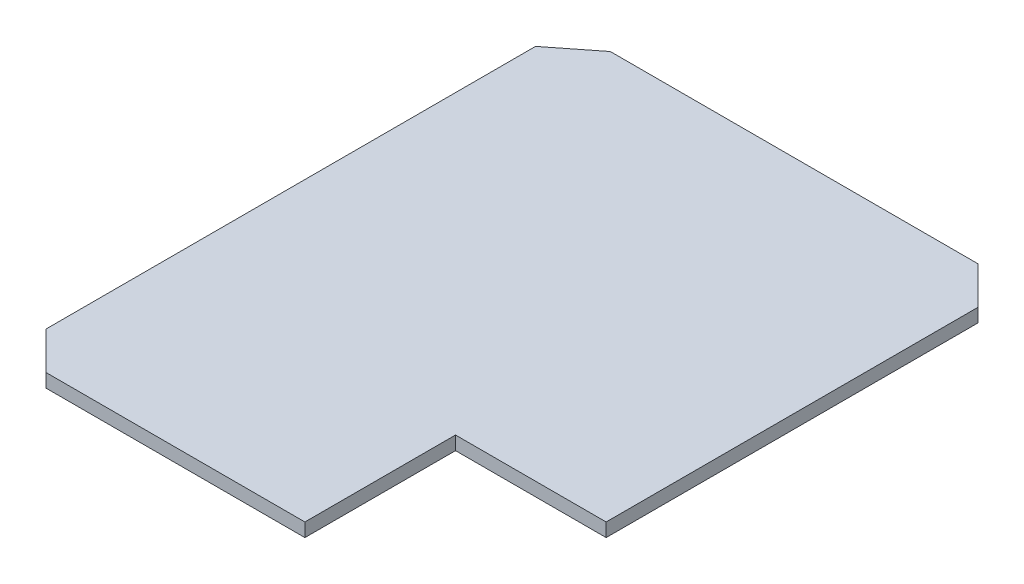
ISO-10303-21;
HEADER;
FILE_DESCRIPTION(('STEP AP214'),'2;1');
FILE_NAME('part.step','',(''),(''),'','','');
FILE_SCHEMA(('AUTOMOTIVE_DESIGN { 1 0 10303 214 1 1 1 1 }'));
ENDSEC;
DATA;
#1=APPLICATION_CONTEXT('core data for automotive mechanical design processes');
#2=APPLICATION_PROTOCOL_DEFINITION('international standard','automotive_design',2000,#1);
#3=PRODUCT_CONTEXT('',#1,'mechanical');
#4=PRODUCT('Part','Part','',(#3));
#5=PRODUCT_RELATED_PRODUCT_CATEGORY('part','',(#4));
#6=PRODUCT_DEFINITION_FORMATION('','',#4);
#7=PRODUCT_DEFINITION_CONTEXT('part definition',#1,'design');
#8=PRODUCT_DEFINITION('design','',#6,#7);
#9=PRODUCT_DEFINITION_SHAPE('','',#8);
#10=(LENGTH_UNIT() NAMED_UNIT(*) SI_UNIT(.MILLI.,.METRE.));
#11=(NAMED_UNIT(*) PLANE_ANGLE_UNIT() SI_UNIT($,.RADIAN.));
#12=(NAMED_UNIT(*) SI_UNIT($,.STERADIAN.) SOLID_ANGLE_UNIT());
#13=UNCERTAINTY_MEASURE_WITH_UNIT(LENGTH_MEASURE(1.E-05),#10,'distance_accuracy_value','');
#14=(GEOMETRIC_REPRESENTATION_CONTEXT(3) GLOBAL_UNCERTAINTY_ASSIGNED_CONTEXT((#13)) GLOBAL_UNIT_ASSIGNED_CONTEXT((#10,
#11,#12)) REPRESENTATION_CONTEXT('',''));
#15=CARTESIAN_POINT('',(0.,0.,0.));
#16=DIRECTION('',(0.,0.,1.));
#17=DIRECTION('',(1.,0.,0.));
#18=AXIS2_PLACEMENT_3D('',#15,#16,#17);
#19=CARTESIAN_POINT('',(146.05,18.288,571.79217167905));
#20=DIRECTION('',(0.,0.,-1.));
#21=DIRECTION('',(-1.,0.,0.));
#22=AXIS2_PLACEMENT_3D('',#19,#20,#21);
#23=PLANE('',#22);
#24=DIRECTION('',(1.,0.,0.));
#25=VECTOR('',#24,1.);
#26=CARTESIAN_POINT('',(146.05,0.,571.79217167905));
#27=LINE('',#26,#25);
#28=CARTESIAN_POINT('',(-203.2,0.,571.79217167905));
#29=VERTEX_POINT('',#28);
#30=CARTESIAN_POINT('',(146.05,0.,571.79217167905));
#31=VERTEX_POINT('',#30);
#32=EDGE_CURVE('E134',#29,#31,#27,.T.);
#33=ORIENTED_EDGE('',*,*,#32,.T.);
#34=DIRECTION('',(0.,-1.,0.));
#35=VECTOR('',#34,1.);
#36=CARTESIAN_POINT('',(146.05,18.288,571.79217167905));
#37=LINE('',#36,#35);
#38=CARTESIAN_POINT('',(146.05,18.288,571.79217167905));
#39=VERTEX_POINT('',#38);
#40=EDGE_CURVE('E11',#39,#31,#37,.T.);
#41=ORIENTED_EDGE('',*,*,#40,.F.);
#42=DIRECTION('',(1.,0.,0.));
#43=VECTOR('',#42,1.);
#44=CARTESIAN_POINT('',(146.05,18.288,571.79217167905));
#45=LINE('',#44,#43);
#46=CARTESIAN_POINT('',(-203.2,18.288,571.79217167905));
#47=VERTEX_POINT('',#46);
#48=EDGE_CURVE('E150',#47,#39,#45,.T.);
#49=ORIENTED_EDGE('',*,*,#48,.F.);
#50=DIRECTION('',(0.,-1.,0.));
#51=VECTOR('',#50,1.);
#52=CARTESIAN_POINT('',(-203.2,18.288,571.79217167905));
#53=LINE('',#52,#51);
#54=EDGE_CURVE('E130',#47,#29,#53,.T.);
#55=ORIENTED_EDGE('',*,*,#54,.T.);
#56=EDGE_LOOP('',(#33,#41,#49,#55));
#57=FACE_BOUND('',#56,.T.);
#58=ADVANCED_FACE('F32',(#57),#23,.F.);
#59=CARTESIAN_POINT('',(146.05,18.288,571.79217167905));
#60=DIRECTION('',(-1.,0.,0.));
#61=DIRECTION('',(0.,0.,1.));
#62=AXIS2_PLACEMENT_3D('',#59,#60,#61);
#63=PLANE('',#62);
#64=DIRECTION('',(0.,0.,-1.));
#65=VECTOR('',#64,1.);
#66=CARTESIAN_POINT('',(146.05,0.,571.79217167905));
#67=LINE('',#66,#65);
#68=CARTESIAN_POINT('',(146.05,0.,368.59217167905));
#69=VERTEX_POINT('',#68);
#70=EDGE_CURVE('E137',#31,#69,#67,.T.);
#71=ORIENTED_EDGE('',*,*,#70,.T.);
#72=DIRECTION('',(0.,-1.,0.));
#73=VECTOR('',#72,1.);
#74=CARTESIAN_POINT('',(146.05,18.288,368.59217167905));
#75=LINE('',#74,#73);
#76=CARTESIAN_POINT('',(146.05,18.288,368.59217167905));
#77=VERTEX_POINT('',#76);
#78=EDGE_CURVE('E40',#77,#69,#75,.T.);
#79=ORIENTED_EDGE('',*,*,#78,.F.);
#80=DIRECTION('',(0.,0.,-1.));
#81=VECTOR('',#80,1.);
#82=CARTESIAN_POINT('',(146.05,18.288,571.79217167905));
#83=LINE('',#82,#81);
#84=EDGE_CURVE('E94',#39,#77,#83,.T.);
#85=ORIENTED_EDGE('',*,*,#84,.F.);
#86=ORIENTED_EDGE('',*,*,#40,.T.);
#87=EDGE_LOOP('',(#71,#79,#85,#86));
#88=FACE_BOUND('',#87,.T.);
#89=ADVANCED_FACE('F193',(#88),#63,.F.);
#90=CARTESIAN_POINT('',(146.05,18.288,368.59217167905));
#91=DIRECTION('',(0.,0.,-1.));
#92=DIRECTION('',(-1.,0.,0.));
#93=AXIS2_PLACEMENT_3D('',#90,#91,#92);
#94=PLANE('',#93);
#95=DIRECTION('',(1.,0.,0.));
#96=VECTOR('',#95,1.);
#97=CARTESIAN_POINT('',(146.05,0.,368.59217167905));
#98=LINE('',#97,#96);
#99=CARTESIAN_POINT('',(349.25,0.,368.59217167905));
#100=VERTEX_POINT('',#99);
#101=EDGE_CURVE('E139',#69,#100,#98,.T.);
#102=ORIENTED_EDGE('',*,*,#101,.T.);
#103=DIRECTION('',(0.,-1.,0.));
#104=VECTOR('',#103,1.);
#105=CARTESIAN_POINT('',(349.25,18.288,368.59217167905));
#106=LINE('',#105,#104);
#107=CARTESIAN_POINT('',(349.25,18.288,368.59217167905));
#108=VERTEX_POINT('',#107);
#109=EDGE_CURVE('E160',#108,#100,#106,.T.);
#110=ORIENTED_EDGE('',*,*,#109,.F.);
#111=DIRECTION('',(1.,0.,0.));
#112=VECTOR('',#111,1.);
#113=CARTESIAN_POINT('',(146.05,18.288,368.59217167905));
#114=LINE('',#113,#112);
#115=EDGE_CURVE('E168',#77,#108,#114,.T.);
#116=ORIENTED_EDGE('',*,*,#115,.F.);
#117=ORIENTED_EDGE('',*,*,#78,.T.);
#118=EDGE_LOOP('',(#102,#110,#116,#117));
#119=FACE_BOUND('',#118,.T.);
#120=ADVANCED_FACE('F166',(#119),#94,.F.);
#121=CARTESIAN_POINT('',(349.25,18.288,-133.057828320949));
#122=DIRECTION('',(-1.,0.,0.));
#123=DIRECTION('',(0.,0.,1.));
#124=AXIS2_PLACEMENT_3D('',#121,#122,#123);
#125=PLANE('',#124);
#126=DIRECTION('',(0.,0.,-1.));
#127=VECTOR('',#126,1.);
#128=CARTESIAN_POINT('',(349.25,0.,-133.057828320949));
#129=LINE('',#128,#127);
#130=CARTESIAN_POINT('',(349.25,0.,-133.057828320949));
#131=VERTEX_POINT('',#130);
#132=EDGE_CURVE('E141',#100,#131,#129,.T.);
#133=ORIENTED_EDGE('',*,*,#132,.T.);
#134=DIRECTION('',(0.,-1.,0.));
#135=VECTOR('',#134,1.);
#136=CARTESIAN_POINT('',(349.25,18.288,-133.057828320949));
#137=LINE('',#136,#135);
#138=CARTESIAN_POINT('',(349.25,18.288,-133.057828320949));
#139=VERTEX_POINT('',#138);
#140=EDGE_CURVE('E157',#139,#131,#137,.T.);
#141=ORIENTED_EDGE('',*,*,#140,.F.);
#142=DIRECTION('',(0.,0.,-1.));
#143=VECTOR('',#142,1.);
#144=CARTESIAN_POINT('',(349.25,18.288,-133.057828320949));
#145=LINE('',#144,#143);
#146=EDGE_CURVE('E184',#108,#139,#145,.T.);
#147=ORIENTED_EDGE('',*,*,#146,.F.);
#148=ORIENTED_EDGE('',*,*,#109,.T.);
#149=EDGE_LOOP('',(#133,#141,#147,#148));
#150=FACE_BOUND('',#149,.T.);
#151=ADVANCED_FACE('F177',(#150),#125,.F.);
#152=CARTESIAN_POINT('',(298.45,18.288,-183.857828320949));
#153=DIRECTION('',(-0.707106781186547,0.,0.707106781186548));
#154=DIRECTION('',(0.707106781186548,0.,0.707106781186547));
#155=AXIS2_PLACEMENT_3D('',#152,#153,#154);
#156=PLANE('',#155);
#157=DIRECTION('',(-0.707106781186548,0.,-0.707106781186547));
#158=VECTOR('',#157,1.);
#159=CARTESIAN_POINT('',(298.45,0.,-183.857828320949));
#160=LINE('',#159,#158);
#161=CARTESIAN_POINT('',(298.45,0.,-183.857828320949));
#162=VERTEX_POINT('',#161);
#163=EDGE_CURVE('E143',#131,#162,#160,.T.);
#164=ORIENTED_EDGE('',*,*,#163,.T.);
#165=DIRECTION('',(0.,-1.,0.));
#166=VECTOR('',#165,1.);
#167=CARTESIAN_POINT('',(298.45,18.288,-183.857828320949));
#168=LINE('',#167,#166);
#169=CARTESIAN_POINT('',(298.45,18.288,-183.857828320949));
#170=VERTEX_POINT('',#169);
#171=EDGE_CURVE('E154',#170,#162,#168,.T.);
#172=ORIENTED_EDGE('',*,*,#171,.F.);
#173=DIRECTION('',(-0.707106781186548,0.,-0.707106781186547));
#174=VECTOR('',#173,1.);
#175=CARTESIAN_POINT('',(298.45,18.288,-183.857828320949));
#176=LINE('',#175,#174);
#177=EDGE_CURVE('E183',#139,#170,#176,.T.);
#178=ORIENTED_EDGE('',*,*,#177,.F.);
#179=ORIENTED_EDGE('',*,*,#140,.T.);
#180=EDGE_LOOP('',(#164,#172,#178,#179));
#181=FACE_BOUND('',#180,.T.);
#182=ADVANCED_FACE('F181',(#181),#156,.F.);
#183=CARTESIAN_POINT('',(-197.559965450046,18.288,-183.85782832095));
#184=DIRECTION('',(0.,0.,1.));
#185=DIRECTION('',(1.,0.,0.));
#186=AXIS2_PLACEMENT_3D('',#183,#184,#185);
#187=PLANE('',#186);
#188=DIRECTION('',(-1.,0.,0.));
#189=VECTOR('',#188,1.);
#190=CARTESIAN_POINT('',(-197.559965450046,0.,-183.85782832095));
#191=LINE('',#190,#189);
#192=CARTESIAN_POINT('',(-197.559965450046,0.,-183.85782832095));
#193=VERTEX_POINT('',#192);
#194=EDGE_CURVE('E145',#162,#193,#191,.T.);
#195=ORIENTED_EDGE('',*,*,#194,.T.);
#196=DIRECTION('',(0.,-1.,0.));
#197=VECTOR('',#196,1.);
#198=CARTESIAN_POINT('',(-197.559965450046,18.288,-183.85782832095));
#199=LINE('',#198,#197);
#200=CARTESIAN_POINT('',(-197.559965450046,18.288,-183.85782832095));
#201=VERTEX_POINT('',#200);
#202=EDGE_CURVE('E125',#201,#193,#199,.T.);
#203=ORIENTED_EDGE('',*,*,#202,.F.);
#204=DIRECTION('',(-1.,0.,0.));
#205=VECTOR('',#204,1.);
#206=CARTESIAN_POINT('',(-197.559965450046,18.288,-183.85782832095));
#207=LINE('',#206,#205);
#208=EDGE_CURVE('E116',#170,#201,#207,.T.);
#209=ORIENTED_EDGE('',*,*,#208,.F.);
#210=ORIENTED_EDGE('',*,*,#171,.T.);
#211=EDGE_LOOP('',(#195,#203,#209,#210));
#212=FACE_BOUND('',#211,.T.);
#213=ADVANCED_FACE('F205',(#212),#187,.F.);
#214=CARTESIAN_POINT('',(-197.559965450046,18.288,-183.85782832095));
#215=DIRECTION('',(0.61871843353823,0.,0.785612818123533));
#216=DIRECTION('',(0.785612818123533,0.,-0.61871843353823));
#217=AXIS2_PLACEMENT_3D('',#214,#215,#216);
#218=PLANE('',#217);
#219=DIRECTION('',(-0.785612818123533,0.,0.61871843353823));
#220=VECTOR('',#219,1.);
#221=CARTESIAN_POINT('',(-197.559965450046,0.,-183.85782832095));
#222=LINE('',#221,#220);
#223=CARTESIAN_POINT('',(-254.,0.,-139.407828320949));
#224=VERTEX_POINT('',#223);
#225=EDGE_CURVE('E124',#193,#224,#222,.T.);
#226=ORIENTED_EDGE('',*,*,#225,.T.);
#227=DIRECTION('',(0.,-1.,0.));
#228=VECTOR('',#227,1.);
#229=CARTESIAN_POINT('',(-254.,18.288,-139.407828320949));
#230=LINE('',#229,#228);
#231=CARTESIAN_POINT('',(-254.,18.288,-139.407828320949));
#232=VERTEX_POINT('',#231);
#233=EDGE_CURVE('E121',#232,#224,#230,.T.);
#234=ORIENTED_EDGE('',*,*,#233,.F.);
#235=DIRECTION('',(-0.785612818123533,0.,0.61871843353823));
#236=VECTOR('',#235,1.);
#237=CARTESIAN_POINT('',(-197.559965450046,18.288,-183.85782832095));
#238=LINE('',#237,#236);
#239=EDGE_CURVE('E110',#201,#232,#238,.T.);
#240=ORIENTED_EDGE('',*,*,#239,.F.);
#241=ORIENTED_EDGE('',*,*,#202,.T.);
#242=EDGE_LOOP('',(#226,#234,#240,#241));
#243=FACE_BOUND('',#242,.T.);
#244=ADVANCED_FACE('F122',(#243),#218,.F.);
#245=CARTESIAN_POINT('',(-254.,18.288,520.99217167905));
#246=DIRECTION('',(1.,0.,0.));
#247=DIRECTION('',(0.,0.,-1.));
#248=AXIS2_PLACEMENT_3D('',#245,#246,#247);
#249=PLANE('',#248);
#250=DIRECTION('',(0.,0.,1.));
#251=VECTOR('',#250,1.);
#252=CARTESIAN_POINT('',(-254.,0.,520.99217167905));
#253=LINE('',#252,#251);
#254=CARTESIAN_POINT('',(-254.,0.,520.99217167905));
#255=VERTEX_POINT('',#254);
#256=EDGE_CURVE('E80',#224,#255,#253,.T.);
#257=ORIENTED_EDGE('',*,*,#256,.T.);
#258=DIRECTION('',(0.,-1.,0.));
#259=VECTOR('',#258,1.);
#260=CARTESIAN_POINT('',(-254.,18.288,520.99217167905));
#261=LINE('',#260,#259);
#262=CARTESIAN_POINT('',(-254.,18.288,520.99217167905));
#263=VERTEX_POINT('',#262);
#264=EDGE_CURVE('E126',#263,#255,#261,.T.);
#265=ORIENTED_EDGE('',*,*,#264,.F.);
#266=DIRECTION('',(0.,0.,1.));
#267=VECTOR('',#266,1.);
#268=CARTESIAN_POINT('',(-254.,18.288,520.99217167905));
#269=LINE('',#268,#267);
#270=EDGE_CURVE('E114',#232,#263,#269,.T.);
#271=ORIENTED_EDGE('',*,*,#270,.F.);
#272=ORIENTED_EDGE('',*,*,#233,.T.);
#273=EDGE_LOOP('',(#257,#265,#271,#272));
#274=FACE_BOUND('',#273,.T.);
#275=ADVANCED_FACE('F128',(#274),#249,.F.);
#276=CARTESIAN_POINT('',(-203.2,18.288,571.79217167905));
#277=DIRECTION('',(0.707106781186548,0.,-0.707106781186548));
#278=DIRECTION('',(-0.707106781186548,0.,-0.707106781186548));
#279=AXIS2_PLACEMENT_3D('',#276,#277,#278);
#280=PLANE('',#279);
#281=DIRECTION('',(0.707106781186547,0.,0.707106781186547));
#282=VECTOR('',#281,1.);
#283=CARTESIAN_POINT('',(-203.2,0.,571.79217167905));
#284=LINE('',#283,#282);
#285=EDGE_CURVE('E86',#255,#29,#284,.T.);
#286=ORIENTED_EDGE('',*,*,#285,.T.);
#287=ORIENTED_EDGE('',*,*,#54,.F.);
#288=DIRECTION('',(0.707106781186547,0.,0.707106781186547));
#289=VECTOR('',#288,1.);
#290=CARTESIAN_POINT('',(-203.2,18.288,571.79217167905));
#291=LINE('',#290,#289);
#292=EDGE_CURVE('E48',#263,#47,#291,.T.);
#293=ORIENTED_EDGE('',*,*,#292,.F.);
#294=ORIENTED_EDGE('',*,*,#264,.T.);
#295=EDGE_LOOP('',(#286,#287,#293,#294));
#296=FACE_BOUND('',#295,.T.);
#297=ADVANCED_FACE('F213',(#296),#280,.F.);
#298=CARTESIAN_POINT('',(0.,18.288,0.));
#299=DIRECTION('',(0.,-1.,0.));
#300=DIRECTION('',(0.,0.,-1.));
#301=AXIS2_PLACEMENT_3D('',#298,#299,#300);
#302=PLANE('',#301);
#303=ORIENTED_EDGE('',*,*,#48,.T.);
#304=ORIENTED_EDGE('',*,*,#84,.T.);
#305=ORIENTED_EDGE('',*,*,#115,.T.);
#306=ORIENTED_EDGE('',*,*,#146,.T.);
#307=ORIENTED_EDGE('',*,*,#177,.T.);
#308=ORIENTED_EDGE('',*,*,#208,.T.);
#309=ORIENTED_EDGE('',*,*,#239,.T.);
#310=ORIENTED_EDGE('',*,*,#270,.T.);
#311=ORIENTED_EDGE('',*,*,#292,.T.);
#312=EDGE_LOOP('',(#303,#304,#305,#306,#307,#308,#309,#310,#311));
#313=FACE_BOUND('',#312,.T.);
#314=ADVANCED_FACE('F112',(#313),#302,.F.);
#315=CARTESIAN_POINT('',(0.,0.,0.));
#316=DIRECTION('',(0.,-1.,0.));
#317=DIRECTION('',(0.,0.,-1.));
#318=AXIS2_PLACEMENT_3D('',#315,#316,#317);
#319=PLANE('',#318);
#320=ORIENTED_EDGE('',*,*,#32,.F.);
#321=ORIENTED_EDGE('',*,*,#285,.F.);
#322=ORIENTED_EDGE('',*,*,#256,.F.);
#323=ORIENTED_EDGE('',*,*,#225,.F.);
#324=ORIENTED_EDGE('',*,*,#194,.F.);
#325=ORIENTED_EDGE('',*,*,#163,.F.);
#326=ORIENTED_EDGE('',*,*,#132,.F.);
#327=ORIENTED_EDGE('',*,*,#101,.F.);
#328=ORIENTED_EDGE('',*,*,#70,.F.);
#329=EDGE_LOOP('',(#320,#321,#322,#323,#324,#325,#326,#327,#328));
#330=FACE_BOUND('',#329,.T.);
#331=ADVANCED_FACE('F172',(#330),#319,.T.);
#332=CLOSED_SHELL('',(#58,#89,#120,#151,#182,#213,#244,#275,#297,#314,#331));
#333=MANIFOLD_SOLID_BREP('B2',#332);
#334=ADVANCED_BREP_SHAPE_REPRESENTATION('',(#18,#333),#14);
#335=SHAPE_DEFINITION_REPRESENTATION(#9,#334);
ENDSEC;
END-ISO-10303-21;
